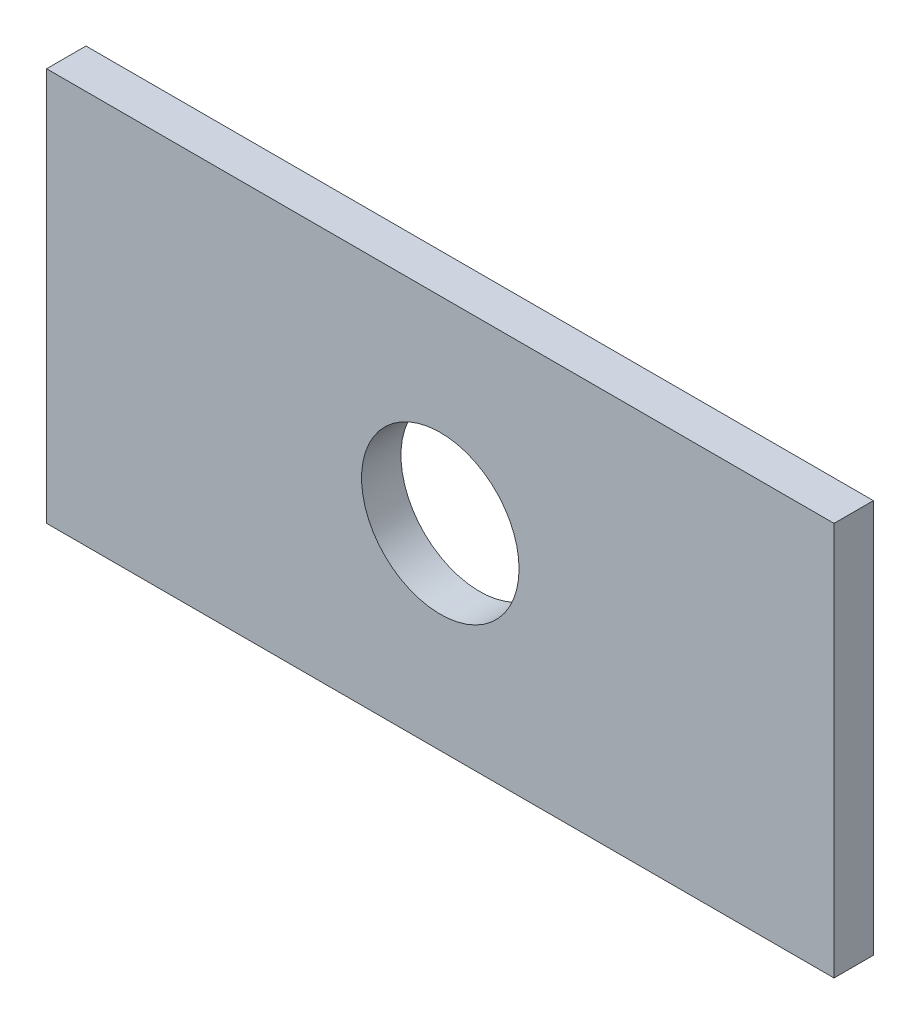
ISO-10303-21;
HEADER;
FILE_DESCRIPTION(('STEP AP214'),'2;1');
FILE_NAME('part.step','',(''),(''),'','','');
FILE_SCHEMA(('AUTOMOTIVE_DESIGN { 1 0 10303 214 1 1 1 1 }'));
ENDSEC;
DATA;
#1=APPLICATION_CONTEXT('core data for automotive mechanical design processes');
#2=APPLICATION_PROTOCOL_DEFINITION('international standard','automotive_design',2000,#1);
#3=PRODUCT_CONTEXT('',#1,'mechanical');
#4=PRODUCT('Part','Part','',(#3));
#5=PRODUCT_RELATED_PRODUCT_CATEGORY('part','',(#4));
#6=PRODUCT_DEFINITION_FORMATION('','',#4);
#7=PRODUCT_DEFINITION_CONTEXT('part definition',#1,'design');
#8=PRODUCT_DEFINITION('design','',#6,#7);
#9=PRODUCT_DEFINITION_SHAPE('','',#8);
#10=(LENGTH_UNIT() NAMED_UNIT(*) SI_UNIT(.MILLI.,.METRE.));
#11=(NAMED_UNIT(*) PLANE_ANGLE_UNIT() SI_UNIT($,.RADIAN.));
#12=(NAMED_UNIT(*) SI_UNIT($,.STERADIAN.) SOLID_ANGLE_UNIT());
#13=UNCERTAINTY_MEASURE_WITH_UNIT(LENGTH_MEASURE(1.E-05),#10,'distance_accuracy_value','');
#14=(GEOMETRIC_REPRESENTATION_CONTEXT(3) GLOBAL_UNCERTAINTY_ASSIGNED_CONTEXT((#13)) GLOBAL_UNIT_ASSIGNED_CONTEXT((#10,
#11,#12)) REPRESENTATION_CONTEXT('',''));
#15=CARTESIAN_POINT('',(0.,0.,0.));
#16=DIRECTION('',(0.,0.,1.));
#17=DIRECTION('',(1.,0.,0.));
#18=AXIS2_PLACEMENT_3D('',#15,#16,#17);
#19=CARTESIAN_POINT('',(-100.,-50.,10.));
#20=DIRECTION('',(0.,1.,0.));
#21=DIRECTION('',(0.,0.,1.));
#22=AXIS2_PLACEMENT_3D('',#19,#20,#21);
#23=PLANE('',#22);
#24=DIRECTION('',(1.,0.,0.));
#25=VECTOR('',#24,1.);
#26=CARTESIAN_POINT('',(-100.,-50.,0.));
#27=LINE('',#26,#25);
#28=CARTESIAN_POINT('',(-100.,-50.,0.));
#29=VERTEX_POINT('',#28);
#30=CARTESIAN_POINT('',(100.,-50.,0.));
#31=VERTEX_POINT('',#30);
#32=EDGE_CURVE('E101',#29,#31,#27,.T.);
#33=ORIENTED_EDGE('',*,*,#32,.T.);
#34=DIRECTION('',(0.,0.,-1.));
#35=VECTOR('',#34,1.);
#36=CARTESIAN_POINT('',(100.,-50.,10.));
#37=LINE('',#36,#35);
#38=CARTESIAN_POINT('',(100.,-50.,10.));
#39=VERTEX_POINT('',#38);
#40=EDGE_CURVE('E12',#39,#31,#37,.T.);
#41=ORIENTED_EDGE('',*,*,#40,.F.);
#42=DIRECTION('',(1.,0.,0.));
#43=VECTOR('',#42,1.);
#44=CARTESIAN_POINT('',(-100.,-50.,10.));
#45=LINE('',#44,#43);
#46=CARTESIAN_POINT('',(-100.,-50.,10.));
#47=VERTEX_POINT('',#46);
#48=EDGE_CURVE('E147',#47,#39,#45,.T.);
#49=ORIENTED_EDGE('',*,*,#48,.F.);
#50=DIRECTION('',(0.,0.,-1.));
#51=VECTOR('',#50,1.);
#52=CARTESIAN_POINT('',(-100.,-50.,10.));
#53=LINE('',#52,#51);
#54=EDGE_CURVE('E114',#47,#29,#53,.T.);
#55=ORIENTED_EDGE('',*,*,#54,.T.);
#56=EDGE_LOOP('',(#33,#41,#49,#55));
#57=FACE_BOUND('',#56,.T.);
#58=ADVANCED_FACE('F56',(#57),#23,.F.);
#59=CARTESIAN_POINT('',(100.,-50.,10.));
#60=DIRECTION('',(-1.,0.,0.));
#61=DIRECTION('',(0.,0.,1.));
#62=AXIS2_PLACEMENT_3D('',#59,#60,#61);
#63=PLANE('',#62);
#64=DIRECTION('',(0.,1.,0.));
#65=VECTOR('',#64,1.);
#66=CARTESIAN_POINT('',(100.,-50.,0.));
#67=LINE('',#66,#65);
#68=CARTESIAN_POINT('',(100.,50.,0.));
#69=VERTEX_POINT('',#68);
#70=EDGE_CURVE('E97',#31,#69,#67,.T.);
#71=ORIENTED_EDGE('',*,*,#70,.T.);
#72=DIRECTION('',(0.,0.,-1.));
#73=VECTOR('',#72,1.);
#74=CARTESIAN_POINT('',(100.,50.,10.));
#75=LINE('',#74,#73);
#76=CARTESIAN_POINT('',(100.,50.,10.));
#77=VERTEX_POINT('',#76);
#78=EDGE_CURVE('E64',#77,#69,#75,.T.);
#79=ORIENTED_EDGE('',*,*,#78,.F.);
#80=DIRECTION('',(0.,1.,0.));
#81=VECTOR('',#80,1.);
#82=CARTESIAN_POINT('',(100.,-50.,10.));
#83=LINE('',#82,#81);
#84=EDGE_CURVE('E110',#39,#77,#83,.T.);
#85=ORIENTED_EDGE('',*,*,#84,.F.);
#86=ORIENTED_EDGE('',*,*,#40,.T.);
#87=EDGE_LOOP('',(#71,#79,#85,#86));
#88=FACE_BOUND('',#87,.T.);
#89=ADVANCED_FACE('F109',(#88),#63,.F.);
#90=CARTESIAN_POINT('',(-100.,50.,10.));
#91=DIRECTION('',(0.,-1.,0.));
#92=DIRECTION('',(1.,0.,0.));
#93=AXIS2_PLACEMENT_3D('',#90,#91,#92);
#94=PLANE('',#93);
#95=DIRECTION('',(-1.,0.,0.));
#96=VECTOR('',#95,1.);
#97=CARTESIAN_POINT('',(-100.,50.,0.));
#98=LINE('',#97,#96);
#99=CARTESIAN_POINT('',(-100.,50.,0.));
#100=VERTEX_POINT('',#99);
#101=EDGE_CURVE('E102',#69,#100,#98,.T.);
#102=ORIENTED_EDGE('',*,*,#101,.T.);
#103=DIRECTION('',(0.,0.,-1.));
#104=VECTOR('',#103,1.);
#105=CARTESIAN_POINT('',(-100.,50.,10.));
#106=LINE('',#105,#104);
#107=CARTESIAN_POINT('',(-100.,50.,10.));
#108=VERTEX_POINT('',#107);
#109=EDGE_CURVE('E139',#108,#100,#106,.T.);
#110=ORIENTED_EDGE('',*,*,#109,.F.);
#111=DIRECTION('',(-1.,0.,0.));
#112=VECTOR('',#111,1.);
#113=CARTESIAN_POINT('',(-100.,50.,10.));
#114=LINE('',#113,#112);
#115=EDGE_CURVE('E76',#77,#108,#114,.T.);
#116=ORIENTED_EDGE('',*,*,#115,.F.);
#117=ORIENTED_EDGE('',*,*,#78,.T.);
#118=EDGE_LOOP('',(#102,#110,#116,#117));
#119=FACE_BOUND('',#118,.T.);
#120=ADVANCED_FACE('F144',(#119),#94,.F.);
#121=CARTESIAN_POINT('',(-100.,-50.,10.));
#122=DIRECTION('',(1.,0.,0.));
#123=DIRECTION('',(0.,0.,-1.));
#124=AXIS2_PLACEMENT_3D('',#121,#122,#123);
#125=PLANE('',#124);
#126=DIRECTION('',(0.,-1.,0.));
#127=VECTOR('',#126,1.);
#128=CARTESIAN_POINT('',(-100.,-50.,0.));
#129=LINE('',#128,#127);
#130=EDGE_CURVE('E149',#100,#29,#129,.T.);
#131=ORIENTED_EDGE('',*,*,#130,.T.);
#132=ORIENTED_EDGE('',*,*,#54,.F.);
#133=DIRECTION('',(0.,-1.,0.));
#134=VECTOR('',#133,1.);
#135=CARTESIAN_POINT('',(-100.,-50.,10.));
#136=LINE('',#135,#134);
#137=EDGE_CURVE('E71',#108,#47,#136,.T.);
#138=ORIENTED_EDGE('',*,*,#137,.F.);
#139=ORIENTED_EDGE('',*,*,#109,.T.);
#140=EDGE_LOOP('',(#131,#132,#138,#139));
#141=FACE_BOUND('',#140,.T.);
#142=ADVANCED_FACE('F155',(#141),#125,.F.);
#143=CARTESIAN_POINT('',(100.,-50.,10.));
#144=DIRECTION('',(0.,0.,1.));
#145=DIRECTION('',(1.,0.,0.));
#146=AXIS2_PLACEMENT_3D('',#143,#144,#145);
#147=PLANE('',#146);
#148=CARTESIAN_POINT('',(0.,0.,10.));
#149=DIRECTION('',(0.,0.,1.));
#150=DIRECTION('',(1.,0.,0.));
#151=AXIS2_PLACEMENT_3D('',#148,#149,#150);
#152=CIRCLE('',#151,20.);
#153=CARTESIAN_POINT('',(20.,0.,10.));
#154=VERTEX_POINT('',#153);
#155=EDGE_CURVE('E120',#154,#154,#152,.T.);
#156=ORIENTED_EDGE('',*,*,#155,.F.);
#157=EDGE_LOOP('',(#156));
#158=FACE_BOUND('',#157,.T.);
#159=ORIENTED_EDGE('',*,*,#48,.T.);
#160=ORIENTED_EDGE('',*,*,#84,.T.);
#161=ORIENTED_EDGE('',*,*,#115,.T.);
#162=ORIENTED_EDGE('',*,*,#137,.T.);
#163=EDGE_LOOP('',(#159,#160,#161,#162));
#164=FACE_BOUND('',#163,.T.);
#165=ADVANCED_FACE('F156',(#158,#164),#147,.T.);
#166=CARTESIAN_POINT('',(100.,-50.,0.));
#167=DIRECTION('',(0.,0.,1.));
#168=DIRECTION('',(1.,0.,0.));
#169=AXIS2_PLACEMENT_3D('',#166,#167,#168);
#170=PLANE('',#169);
#171=CARTESIAN_POINT('',(0.,0.,0.));
#172=DIRECTION('',(0.,0.,1.));
#173=DIRECTION('',(1.,0.,0.));
#174=AXIS2_PLACEMENT_3D('',#171,#172,#173);
#175=CIRCLE('',#174,20.);
#176=CARTESIAN_POINT('',(20.,0.,0.));
#177=VERTEX_POINT('',#176);
#178=EDGE_CURVE('E116',#177,#177,#175,.T.);
#179=ORIENTED_EDGE('',*,*,#178,.T.);
#180=EDGE_LOOP('',(#179));
#181=FACE_BOUND('',#180,.T.);
#182=ORIENTED_EDGE('',*,*,#32,.F.);
#183=ORIENTED_EDGE('',*,*,#130,.F.);
#184=ORIENTED_EDGE('',*,*,#101,.F.);
#185=ORIENTED_EDGE('',*,*,#70,.F.);
#186=EDGE_LOOP('',(#182,#183,#184,#185));
#187=FACE_BOUND('',#186,.T.);
#188=ADVANCED_FACE('F98',(#181,#187),#170,.F.);
#189=CARTESIAN_POINT('',(0.,0.,0.));
#190=DIRECTION('',(0.,0.,1.));
#191=DIRECTION('',(1.,0.,0.));
#192=AXIS2_PLACEMENT_3D('',#189,#190,#191);
#193=CYLINDRICAL_SURFACE('',#192,20.);
#194=ORIENTED_EDGE('',*,*,#178,.F.);
#195=EDGE_LOOP('',(#194));
#196=FACE_BOUND('',#195,.T.);
#197=ORIENTED_EDGE('',*,*,#155,.T.);
#198=EDGE_LOOP('',(#197));
#199=FACE_BOUND('',#198,.T.);
#200=ADVANCED_FACE('F163',(#196,#199),#193,.F.);
#201=CLOSED_SHELL('',(#58,#89,#120,#142,#165,#188,#200));
#202=MANIFOLD_SOLID_BREP('B2',#201);
#203=ADVANCED_BREP_SHAPE_REPRESENTATION('',(#18,#202),#14);
#204=SHAPE_DEFINITION_REPRESENTATION(#9,#203);
ENDSEC;
END-ISO-10303-21;
